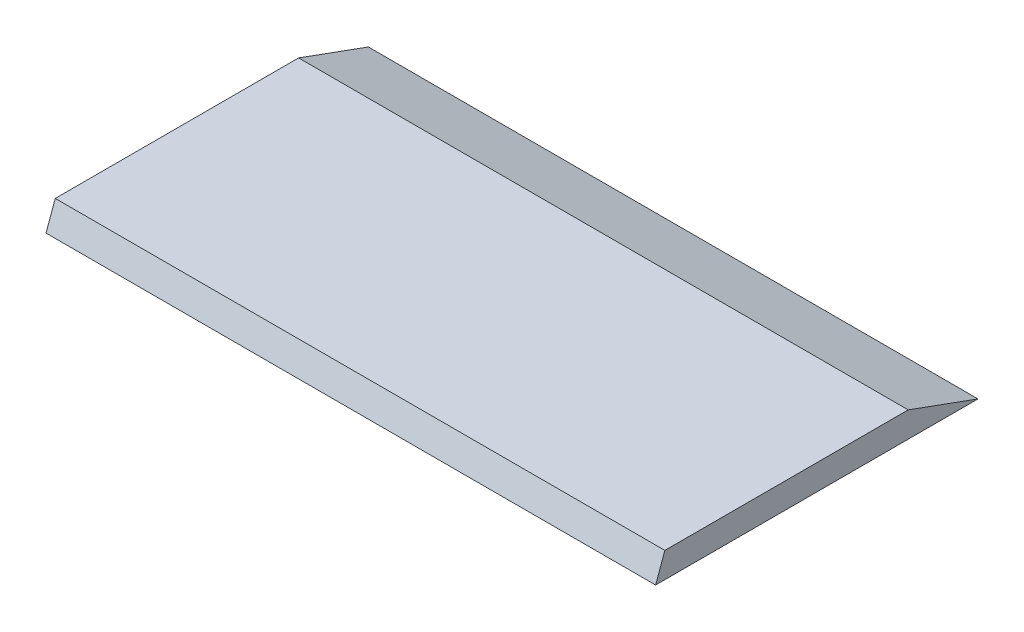
ISO-10303-21;
HEADER;
FILE_DESCRIPTION(('STEP AP214'),'2;1');
FILE_NAME('part.step','',(''),(''),'','','');
FILE_SCHEMA(('AUTOMOTIVE_DESIGN { 1 0 10303 214 1 1 1 1 }'));
ENDSEC;
DATA;
#1=APPLICATION_CONTEXT('core data for automotive mechanical design processes');
#2=APPLICATION_PROTOCOL_DEFINITION('international standard','automotive_design',2000,#1);
#3=PRODUCT_CONTEXT('',#1,'mechanical');
#4=PRODUCT('Part','Part','',(#3));
#5=PRODUCT_RELATED_PRODUCT_CATEGORY('part','',(#4));
#6=PRODUCT_DEFINITION_FORMATION('','',#4);
#7=PRODUCT_DEFINITION_CONTEXT('part definition',#1,'design');
#8=PRODUCT_DEFINITION('design','',#6,#7);
#9=PRODUCT_DEFINITION_SHAPE('','',#8);
#10=(LENGTH_UNIT() NAMED_UNIT(*) SI_UNIT(.MILLI.,.METRE.));
#11=(NAMED_UNIT(*) PLANE_ANGLE_UNIT() SI_UNIT($,.RADIAN.));
#12=(NAMED_UNIT(*) SI_UNIT($,.STERADIAN.) SOLID_ANGLE_UNIT());
#13=UNCERTAINTY_MEASURE_WITH_UNIT(LENGTH_MEASURE(1.E-05),#10,'distance_accuracy_value','');
#14=(GEOMETRIC_REPRESENTATION_CONTEXT(3) GLOBAL_UNCERTAINTY_ASSIGNED_CONTEXT((#13)) GLOBAL_UNIT_ASSIGNED_CONTEXT((#10,
#11,#12)) REPRESENTATION_CONTEXT('',''));
#15=CARTESIAN_POINT('',(0.,0.,0.));
#16=DIRECTION('',(0.,0.,1.));
#17=DIRECTION('',(1.,0.,0.));
#18=AXIS2_PLACEMENT_3D('',#15,#16,#17);
#19=CARTESIAN_POINT('',(0.,10.,0.));
#20=DIRECTION('',(1.,0.,0.));
#21=DIRECTION('',(0.,0.,-1.));
#22=AXIS2_PLACEMENT_3D('',#19,#20,#21);
#23=PLANE('',#22);
#24=DIRECTION('',(0.,0.,1.));
#25=VECTOR('',#24,1.);
#26=CARTESIAN_POINT('',(0.,0.,0.));
#27=LINE('',#26,#25);
#28=CARTESIAN_POINT('',(0.,0.,-126.92));
#29=VERTEX_POINT('',#28);
#30=CARTESIAN_POINT('',(0.,0.,0.));
#31=VERTEX_POINT('',#30);
#32=EDGE_CURVE('E84',#29,#31,#27,.T.);
#33=ORIENTED_EDGE('',*,*,#32,.T.);
#34=DIRECTION('',(0.,-0.939692620785909,0.342020143325667));
#35=VECTOR('',#34,1.);
#36=CARTESIAN_POINT('',(0.,10.,-3.63970234266205));
#37=LINE('',#36,#35);
#38=CARTESIAN_POINT('',(0.,10.,-3.63970234266205));
#39=VERTEX_POINT('',#38);
#40=EDGE_CURVE('E11',#31,#39,#37,.F.);
#41=ORIENTED_EDGE('',*,*,#40,.T.);
#42=DIRECTION('',(0.,0.,1.));
#43=VECTOR('',#42,1.);
#44=CARTESIAN_POINT('',(0.,10.,0.));
#45=LINE('',#44,#43);
#46=CARTESIAN_POINT('',(0.,10.,-99.4452258054538));
#47=VERTEX_POINT('',#46);
#48=EDGE_CURVE('E113',#47,#39,#45,.T.);
#49=ORIENTED_EDGE('',*,*,#48,.F.);
#50=DIRECTION('',(0.,0.342020143325669,0.939692620785909));
#51=VECTOR('',#50,1.);
#52=CARTESIAN_POINT('',(0.,10.,-99.4452258054538));
#53=LINE('',#52,#51);
#54=EDGE_CURVE('E89',#47,#29,#53,.F.);
#55=ORIENTED_EDGE('',*,*,#54,.T.);
#56=EDGE_LOOP('',(#33,#41,#49,#55));
#57=FACE_BOUND('',#56,.T.);
#58=ADVANCED_FACE('F39',(#57),#23,.F.);
#59=CARTESIAN_POINT('',(240.,10.,0.));
#60=DIRECTION('',(-1.,0.,0.));
#61=DIRECTION('',(0.,0.,1.));
#62=AXIS2_PLACEMENT_3D('',#59,#60,#61);
#63=PLANE('',#62);
#64=DIRECTION('',(0.,0.,-1.));
#65=VECTOR('',#64,1.);
#66=CARTESIAN_POINT('',(240.,10.,0.));
#67=LINE('',#66,#65);
#68=CARTESIAN_POINT('',(240.,10.,-3.63970234266205));
#69=VERTEX_POINT('',#68);
#70=CARTESIAN_POINT('',(240.,10.,-99.4452258054538));
#71=VERTEX_POINT('',#70);
#72=EDGE_CURVE('E109',#69,#71,#67,.T.);
#73=ORIENTED_EDGE('',*,*,#72,.F.);
#74=DIRECTION('',(0.,0.939692620785909,-0.342020143325667));
#75=VECTOR('',#74,1.);
#76=CARTESIAN_POINT('',(240.,10.,-3.63970234266205));
#77=LINE('',#76,#75);
#78=CARTESIAN_POINT('',(240.,0.,0.));
#79=VERTEX_POINT('',#78);
#80=EDGE_CURVE('E48',#69,#79,#77,.F.);
#81=ORIENTED_EDGE('',*,*,#80,.T.);
#82=DIRECTION('',(0.,0.,-1.));
#83=VECTOR('',#82,1.);
#84=CARTESIAN_POINT('',(240.,0.,0.));
#85=LINE('',#84,#83);
#86=CARTESIAN_POINT('',(240.,0.,-126.92));
#87=VERTEX_POINT('',#86);
#88=EDGE_CURVE('E86',#79,#87,#85,.T.);
#89=ORIENTED_EDGE('',*,*,#88,.T.);
#90=DIRECTION('',(0.,-0.342020143325669,-0.939692620785909));
#91=VECTOR('',#90,1.);
#92=CARTESIAN_POINT('',(240.,10.,-99.4452258054538));
#93=LINE('',#92,#91);
#94=EDGE_CURVE('E96',#87,#71,#93,.F.);
#95=ORIENTED_EDGE('',*,*,#94,.T.);
#96=EDGE_LOOP('',(#73,#81,#89,#95));
#97=FACE_BOUND('',#96,.T.);
#98=ADVANCED_FACE('F125',(#97),#63,.F.);
#99=CARTESIAN_POINT('',(0.,10.,0.));
#100=DIRECTION('',(0.,-1.,0.));
#101=DIRECTION('',(0.,0.,-1.));
#102=AXIS2_PLACEMENT_3D('',#99,#100,#101);
#103=PLANE('',#102);
#104=ORIENTED_EDGE('',*,*,#48,.T.);
#105=DIRECTION('',(1.,0.,0.));
#106=VECTOR('',#105,1.);
#107=CARTESIAN_POINT('',(0.,10.,-3.63970234266205));
#108=LINE('',#107,#106);
#109=EDGE_CURVE('E92',#39,#69,#108,.T.);
#110=ORIENTED_EDGE('',*,*,#109,.T.);
#111=ORIENTED_EDGE('',*,*,#72,.T.);
#112=DIRECTION('',(-1.,0.,0.));
#113=VECTOR('',#112,1.);
#114=CARTESIAN_POINT('',(0.,10.,-99.4452258054538));
#115=LINE('',#114,#113);
#116=EDGE_CURVE('E105',#71,#47,#115,.T.);
#117=ORIENTED_EDGE('',*,*,#116,.T.);
#118=EDGE_LOOP('',(#104,#110,#111,#117));
#119=FACE_BOUND('',#118,.T.);
#120=ADVANCED_FACE('F119',(#119),#103,.F.);
#121=CARTESIAN_POINT('',(0.,0.,0.));
#122=DIRECTION('',(0.,-1.,0.));
#123=DIRECTION('',(0.,0.,-1.));
#124=AXIS2_PLACEMENT_3D('',#121,#122,#123);
#125=PLANE('',#124);
#126=ORIENTED_EDGE('',*,*,#32,.F.);
#127=DIRECTION('',(-1.,0.,0.));
#128=VECTOR('',#127,1.);
#129=CARTESIAN_POINT('',(0.,0.,-126.92));
#130=LINE('',#129,#128);
#131=EDGE_CURVE('E110',#87,#29,#130,.T.);
#132=ORIENTED_EDGE('',*,*,#131,.F.);
#133=ORIENTED_EDGE('',*,*,#88,.F.);
#134=DIRECTION('',(1.,0.,0.));
#135=VECTOR('',#134,1.);
#136=CARTESIAN_POINT('',(0.,0.,0.));
#137=LINE('',#136,#135);
#138=EDGE_CURVE('E81',#31,#79,#137,.T.);
#139=ORIENTED_EDGE('',*,*,#138,.F.);
#140=EDGE_LOOP('',(#126,#132,#133,#139));
#141=FACE_BOUND('',#140,.T.);
#142=ADVANCED_FACE('F82',(#141),#125,.T.);
#143=CARTESIAN_POINT('',(0.,10.,-99.4452258054538));
#144=DIRECTION('',(0.,-0.939692620785908,0.342020143325669));
#145=DIRECTION('',(-1.,0.,0.));
#146=AXIS2_PLACEMENT_3D('',#143,#144,#145);
#147=PLANE('',#146);
#148=ORIENTED_EDGE('',*,*,#94,.F.);
#149=ORIENTED_EDGE('',*,*,#131,.T.);
#150=ORIENTED_EDGE('',*,*,#54,.F.);
#151=ORIENTED_EDGE('',*,*,#116,.F.);
#152=EDGE_LOOP('',(#148,#149,#150,#151));
#153=FACE_BOUND('',#152,.T.);
#154=ADVANCED_FACE('F123',(#153),#147,.F.);
#155=CARTESIAN_POINT('',(0.,10.,-3.63970234266205));
#156=DIRECTION('',(0.,-0.342020143325667,-0.939692620785909));
#157=DIRECTION('',(1.,0.,0.));
#158=AXIS2_PLACEMENT_3D('',#155,#156,#157);
#159=PLANE('',#158);
#160=ORIENTED_EDGE('',*,*,#40,.F.);
#161=ORIENTED_EDGE('',*,*,#138,.T.);
#162=ORIENTED_EDGE('',*,*,#80,.F.);
#163=ORIENTED_EDGE('',*,*,#109,.F.);
#164=EDGE_LOOP('',(#160,#161,#162,#163));
#165=FACE_BOUND('',#164,.T.);
#166=ADVANCED_FACE('F41',(#165),#159,.F.);
#167=CLOSED_SHELL('',(#58,#98,#120,#142,#154,#166));
#168=MANIFOLD_SOLID_BREP('B2',#167);
#169=ADVANCED_BREP_SHAPE_REPRESENTATION('',(#18,#168),#14);
#170=SHAPE_DEFINITION_REPRESENTATION(#9,#169);
ENDSEC;
END-ISO-10303-21;
